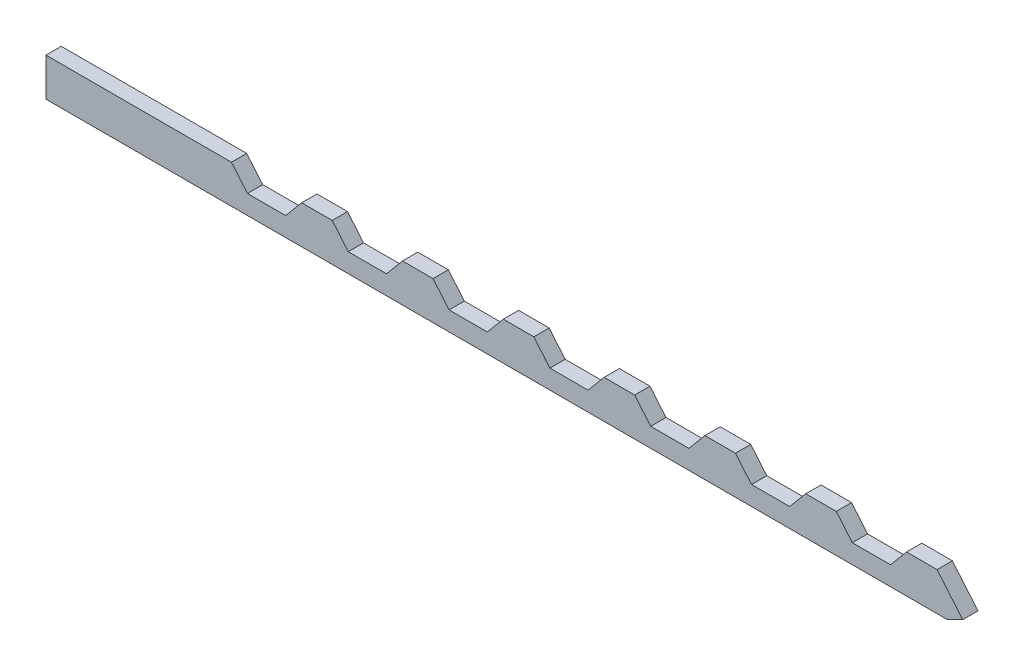
ISO-10303-21;
HEADER;
FILE_DESCRIPTION(('STEP AP214'),'2;1');
FILE_NAME('part.step','',(''),(''),'','','');
FILE_SCHEMA(('AUTOMOTIVE_DESIGN { 1 0 10303 214 1 1 1 1 }'));
ENDSEC;
DATA;
#1=APPLICATION_CONTEXT('core data for automotive mechanical design processes');
#2=APPLICATION_PROTOCOL_DEFINITION('international standard','automotive_design',2000,#1);
#3=PRODUCT_CONTEXT('',#1,'mechanical');
#4=PRODUCT('Part','Part','',(#3));
#5=PRODUCT_RELATED_PRODUCT_CATEGORY('part','',(#4));
#6=PRODUCT_DEFINITION_FORMATION('','',#4);
#7=PRODUCT_DEFINITION_CONTEXT('part definition',#1,'design');
#8=PRODUCT_DEFINITION('design','',#6,#7);
#9=PRODUCT_DEFINITION_SHAPE('','',#8);
#10=(LENGTH_UNIT() NAMED_UNIT(*) SI_UNIT(.MILLI.,.METRE.));
#11=(NAMED_UNIT(*) PLANE_ANGLE_UNIT() SI_UNIT($,.RADIAN.));
#12=(NAMED_UNIT(*) SI_UNIT($,.STERADIAN.) SOLID_ANGLE_UNIT());
#13=UNCERTAINTY_MEASURE_WITH_UNIT(LENGTH_MEASURE(1.E-05),#10,'distance_accuracy_value','');
#14=(GEOMETRIC_REPRESENTATION_CONTEXT(3) GLOBAL_UNCERTAINTY_ASSIGNED_CONTEXT((#13)) GLOBAL_UNIT_ASSIGNED_CONTEXT((#10,
#11,#12)) REPRESENTATION_CONTEXT('',''));
#15=CARTESIAN_POINT('',(0.,0.,0.));
#16=DIRECTION('',(0.,0.,1.));
#17=DIRECTION('',(1.,0.,0.));
#18=AXIS2_PLACEMENT_3D('',#15,#16,#17);
#19=CARTESIAN_POINT('',(152.4,6.35000000000002,5.08));
#20=DIRECTION('',(0.,-1.,0.));
#21=DIRECTION('',(1.,0.,0.));
#22=AXIS2_PLACEMENT_3D('',#19,#20,#21);
#23=PLANE('',#22);
#24=DIRECTION('',(0.,0.,1.));
#25=VECTOR('',#24,1.);
#26=CARTESIAN_POINT('',(110.358182431287,6.35000000000002,0.));
#27=LINE('',#26,#25);
#28=CARTESIAN_POINT('',(110.358182431287,6.35000000000002,0.));
#29=VERTEX_POINT('',#28);
#30=CARTESIAN_POINT('',(110.358182431287,6.35000000000002,5.08));
#31=VERTEX_POINT('',#30);
#32=EDGE_CURVE('E555',#29,#31,#27,.T.);
#33=ORIENTED_EDGE('',*,*,#32,.F.);
#34=DIRECTION('',(-1.,0.,0.));
#35=VECTOR('',#34,1.);
#36=CARTESIAN_POINT('',(152.4,6.35000000000002,0.));
#37=LINE('',#36,#35);
#38=CARTESIAN_POINT('',(100.198182431287,6.35000000000001,0.));
#39=VERTEX_POINT('',#38);
#40=EDGE_CURVE('E594',#29,#39,#37,.T.);
#41=ORIENTED_EDGE('',*,*,#40,.T.);
#42=DIRECTION('',(0.,0.,1.));
#43=VECTOR('',#42,1.);
#44=CARTESIAN_POINT('',(100.198182431287,6.35000000000001,0.));
#45=LINE('',#44,#43);
#46=CARTESIAN_POINT('',(100.198182431287,6.35000000000001,5.08));
#47=VERTEX_POINT('',#46);
#48=EDGE_CURVE('E508',#39,#47,#45,.T.);
#49=ORIENTED_EDGE('',*,*,#48,.T.);
#50=DIRECTION('',(-1.,0.,0.));
#51=VECTOR('',#50,1.);
#52=CARTESIAN_POINT('',(152.4,6.35000000000002,5.08));
#53=LINE('',#52,#51);
#54=EDGE_CURVE('E302',#31,#47,#53,.T.);
#55=ORIENTED_EDGE('',*,*,#54,.F.);
#56=EDGE_LOOP('',(#33,#41,#49,#55));
#57=FACE_BOUND('',#56,.T.);
#58=ADVANCED_FACE('F42',(#57),#23,.F.);
#59=DIRECTION('',(0.,0.,1.));
#60=VECTOR('',#59,1.);
#61=CARTESIAN_POINT('',(133.714747747239,6.35000000000002,0.));
#62=LINE('',#61,#60);
#63=CARTESIAN_POINT('',(133.714747747239,6.35000000000003,0.));
#64=VERTEX_POINT('',#63);
#65=CARTESIAN_POINT('',(133.714747747239,6.35000000000002,5.08));
#66=VERTEX_POINT('',#65);
#67=EDGE_CURVE('E550',#64,#66,#62,.T.);
#68=ORIENTED_EDGE('',*,*,#67,.T.);
#69=CARTESIAN_POINT('',(143.874747747239,6.35000000000002,5.08));
#70=VERTEX_POINT('',#69);
#71=EDGE_CURVE('E296',#70,#66,#53,.T.);
#72=ORIENTED_EDGE('',*,*,#71,.F.);
#73=DIRECTION('',(0.,0.,1.));
#74=VECTOR('',#73,1.);
#75=CARTESIAN_POINT('',(143.874747747239,6.35000000000002,0.));
#76=LINE('',#75,#74);
#77=CARTESIAN_POINT('',(143.874747747239,6.35000000000002,0.));
#78=VERTEX_POINT('',#77);
#79=EDGE_CURVE('E538',#78,#70,#76,.T.);
#80=ORIENTED_EDGE('',*,*,#79,.F.);
#81=EDGE_CURVE('E290',#78,#64,#37,.T.);
#82=ORIENTED_EDGE('',*,*,#81,.T.);
#83=EDGE_LOOP('',(#68,#72,#80,#82));
#84=FACE_BOUND('',#83,.T.);
#85=ADVANCED_FACE('F714',(#84),#23,.F.);
#86=DIRECTION('',(0.,0.,1.));
#87=VECTOR('',#86,1.);
#88=CARTESIAN_POINT('',(76.8416171153359,6.35000000000001,0.));
#89=LINE('',#88,#87);
#90=CARTESIAN_POINT('',(76.8416171153359,6.35000000000001,0.));
#91=VERTEX_POINT('',#90);
#92=CARTESIAN_POINT('',(76.8416171153359,6.35000000000001,5.08));
#93=VERTEX_POINT('',#92);
#94=EDGE_CURVE('E512',#91,#93,#89,.T.);
#95=ORIENTED_EDGE('',*,*,#94,.F.);
#96=CARTESIAN_POINT('',(66.6816171153359,6.35000000000001,0.));
#97=VERTEX_POINT('',#96);
#98=EDGE_CURVE('E598',#91,#97,#37,.T.);
#99=ORIENTED_EDGE('',*,*,#98,.T.);
#100=DIRECTION('',(0.,0.,1.));
#101=VECTOR('',#100,1.);
#102=CARTESIAN_POINT('',(66.6816171153359,6.35000000000001,0.));
#103=LINE('',#102,#101);
#104=CARTESIAN_POINT('',(66.6816171153359,6.35000000000001,5.08));
#105=VERTEX_POINT('',#104);
#106=EDGE_CURVE('E475',#97,#105,#103,.T.);
#107=ORIENTED_EDGE('',*,*,#106,.T.);
#108=EDGE_CURVE('E310',#93,#105,#53,.T.);
#109=ORIENTED_EDGE('',*,*,#108,.F.);
#110=EDGE_LOOP('',(#95,#99,#107,#109));
#111=FACE_BOUND('',#110,.T.);
#112=ADVANCED_FACE('F670',(#111),#23,.F.);
#113=DIRECTION('',(0.,0.,1.));
#114=VECTOR('',#113,1.);
#115=CARTESIAN_POINT('',(43.3250517993844,6.35,0.));
#116=LINE('',#115,#114);
#117=CARTESIAN_POINT('',(43.3250517993844,6.35,0.));
#118=VERTEX_POINT('',#117);
#119=CARTESIAN_POINT('',(43.3250517993844,6.35,5.08));
#120=VERTEX_POINT('',#119);
#121=EDGE_CURVE('E479',#118,#120,#116,.T.);
#122=ORIENTED_EDGE('',*,*,#121,.F.);
#123=CARTESIAN_POINT('',(33.1650517993844,6.35,0.));
#124=VERTEX_POINT('',#123);
#125=EDGE_CURVE('E603',#118,#124,#37,.T.);
#126=ORIENTED_EDGE('',*,*,#125,.T.);
#127=DIRECTION('',(0.,0.,1.));
#128=VECTOR('',#127,1.);
#129=CARTESIAN_POINT('',(33.1650517993844,6.35,0.));
#130=LINE('',#129,#128);
#131=CARTESIAN_POINT('',(33.1650517993844,6.35,5.08));
#132=VERTEX_POINT('',#131);
#133=EDGE_CURVE('E443',#124,#132,#130,.T.);
#134=ORIENTED_EDGE('',*,*,#133,.T.);
#135=EDGE_CURVE('E660',#120,#132,#53,.T.);
#136=ORIENTED_EDGE('',*,*,#135,.F.);
#137=EDGE_LOOP('',(#122,#126,#134,#136));
#138=FACE_BOUND('',#137,.T.);
#139=ADVANCED_FACE('F682',(#138),#23,.F.);
#140=DIRECTION('',(0.,0.,1.));
#141=VECTOR('',#140,1.);
#142=CARTESIAN_POINT('',(-23.7080788325185,6.35,0.));
#143=LINE('',#142,#141);
#144=CARTESIAN_POINT('',(-23.7080788325185,6.35,0.));
#145=VERTEX_POINT('',#144);
#146=CARTESIAN_POINT('',(-23.7080788325185,6.35,5.08));
#147=VERTEX_POINT('',#146);
#148=EDGE_CURVE('E409',#145,#147,#143,.T.);
#149=ORIENTED_EDGE('',*,*,#148,.F.);
#150=CARTESIAN_POINT('',(-33.8680788325185,6.35,0.));
#151=VERTEX_POINT('',#150);
#152=EDGE_CURVE('E615',#145,#151,#37,.T.);
#153=ORIENTED_EDGE('',*,*,#152,.T.);
#154=DIRECTION('',(0.,0.,1.));
#155=VECTOR('',#154,1.);
#156=CARTESIAN_POINT('',(-33.8680788325185,6.35,0.));
#157=LINE('',#156,#155);
#158=CARTESIAN_POINT('',(-33.8680788325185,6.35,5.08));
#159=VERTEX_POINT('',#158);
#160=EDGE_CURVE('E372',#151,#159,#157,.T.);
#161=ORIENTED_EDGE('',*,*,#160,.T.);
#162=EDGE_CURVE('E321',#147,#159,#53,.T.);
#163=ORIENTED_EDGE('',*,*,#162,.F.);
#164=EDGE_LOOP('',(#149,#153,#161,#163));
#165=FACE_BOUND('',#164,.T.);
#166=ADVANCED_FACE('F654',(#165),#23,.F.);
#167=CARTESIAN_POINT('',(9.80848648343298,6.35,5.08));
#168=VERTEX_POINT('',#167);
#169=CARTESIAN_POINT('',(-0.351513516567035,6.35,5.08));
#170=VERTEX_POINT('',#169);
#171=EDGE_CURVE('E657',#168,#170,#53,.T.);
#172=ORIENTED_EDGE('',*,*,#171,.F.);
#173=DIRECTION('',(0.,0.,1.));
#174=VECTOR('',#173,1.);
#175=CARTESIAN_POINT('',(9.80848648343298,6.35,0.));
#176=LINE('',#175,#174);
#177=CARTESIAN_POINT('',(9.80848648343298,6.35,0.));
#178=VERTEX_POINT('',#177);
#179=EDGE_CURVE('E433',#178,#168,#176,.T.);
#180=ORIENTED_EDGE('',*,*,#179,.F.);
#181=CARTESIAN_POINT('',(-0.351513516567035,6.35,0.));
#182=VERTEX_POINT('',#181);
#183=EDGE_CURVE('E609',#178,#182,#37,.T.);
#184=ORIENTED_EDGE('',*,*,#183,.T.);
#185=DIRECTION('',(0.,0.,1.));
#186=VECTOR('',#185,1.);
#187=CARTESIAN_POINT('',(-0.351513516567035,6.35,0.));
#188=LINE('',#187,#186);
#189=EDGE_CURVE('E405',#182,#170,#188,.T.);
#190=ORIENTED_EDGE('',*,*,#189,.T.);
#191=EDGE_LOOP('',(#172,#180,#184,#190));
#192=FACE_BOUND('',#191,.T.);
#193=ADVANCED_FACE('F692',(#192),#23,.F.);
#194=CARTESIAN_POINT('',(-57.2246441484699,6.34999999999999,5.08));
#195=VERTEX_POINT('',#194);
#196=CARTESIAN_POINT('',(-67.38464414847,6.34999999999999,5.08));
#197=VERTEX_POINT('',#196);
#198=EDGE_CURVE('E313',#195,#197,#53,.T.);
#199=ORIENTED_EDGE('',*,*,#198,.F.);
#200=DIRECTION('',(0.,0.,1.));
#201=VECTOR('',#200,1.);
#202=CARTESIAN_POINT('',(-57.2246441484699,6.34999999999999,0.));
#203=LINE('',#202,#201);
#204=CARTESIAN_POINT('',(-57.2246441484699,6.34999999999999,0.));
#205=VERTEX_POINT('',#204);
#206=EDGE_CURVE('E362',#205,#195,#203,.T.);
#207=ORIENTED_EDGE('',*,*,#206,.F.);
#208=CARTESIAN_POINT('',(-67.38464414847,6.34999999999999,0.));
#209=VERTEX_POINT('',#208);
#210=EDGE_CURVE('E288',#205,#209,#37,.T.);
#211=ORIENTED_EDGE('',*,*,#210,.T.);
#212=DIRECTION('',(0.,0.,1.));
#213=VECTOR('',#212,1.);
#214=CARTESIAN_POINT('',(-67.38464414847,6.34999999999999,0.));
#215=LINE('',#214,#213);
#216=EDGE_CURVE('E336',#209,#197,#215,.T.);
#217=ORIENTED_EDGE('',*,*,#216,.T.);
#218=EDGE_LOOP('',(#199,#207,#211,#217));
#219=FACE_BOUND('',#218,.T.);
#220=ADVANCED_FACE('F630',(#219),#23,.F.);
#221=CARTESIAN_POINT('',(0.,0.,5.08));
#222=DIRECTION('',(0.,0.,1.));
#223=DIRECTION('',(1.,0.,0.));
#224=AXIS2_PLACEMENT_3D('',#221,#222,#223);
#225=PLANE('',#224);
#226=DIRECTION('',(-0.894427190999915,-0.447213595499961,0.));
#227=VECTOR('',#226,1.);
#228=CARTESIAN_POINT('',(32.0040000000004,-64.0080000000003,5.08));
#229=LINE('',#228,#227);
#230=CARTESIAN_POINT('',(152.4,-3.80999999999997,5.08));
#231=VERTEX_POINT('',#230);
#232=CARTESIAN_POINT('',(147.32,-6.34999999999998,5.08));
#233=VERTEX_POINT('',#232);
#234=EDGE_CURVE('E263',#231,#233,#229,.T.);
#235=ORIENTED_EDGE('',*,*,#234,.F.);
#236=DIRECTION('',(0.642787609686543,-0.766044443118975,0.));
#237=VECTOR('',#236,1.);
#238=CARTESIAN_POINT('',(87.5559323687312,73.4681505579859,5.08));
#239=LINE('',#238,#237);
#240=EDGE_CURVE('E515',#70,#231,#239,.T.);
#241=ORIENTED_EDGE('',*,*,#240,.F.);
#242=ORIENTED_EDGE('',*,*,#71,.T.);
#243=DIRECTION('',(-0.642787609686538,-0.766044443118979,0.));
#244=VECTOR('',#243,1.);
#245=CARTESIAN_POINT('',(75.3402703945566,-63.2179931008687,5.08));
#246=LINE('',#245,#244);
#247=CARTESIAN_POINT('',(128.386465089263,0.,5.08));
#248=VERTEX_POINT('',#247);
#249=EDGE_CURVE('E566',#66,#248,#246,.T.);
#250=ORIENTED_EDGE('',*,*,#249,.T.);
#251=DIRECTION('',(-1.,0.,0.));
#252=VECTOR('',#251,1.);
#253=CARTESIAN_POINT('',(0.,0.,5.08));
#254=LINE('',#253,#252);
#255=CARTESIAN_POINT('',(115.686465089263,0.,5.08));
#256=VERTEX_POINT('',#255);
#257=EDGE_CURVE('E541',#248,#256,#254,.T.);
#258=ORIENTED_EDGE('',*,*,#257,.T.);
#259=DIRECTION('',(-0.642787609686538,0.76604444311898,0.));
#260=VECTOR('',#259,1.);
#261=CARTESIAN_POINT('',(67.8876044663715,56.9644638692411,5.08));
#262=LINE('',#261,#260);
#263=EDGE_CURVE('E561',#256,#31,#262,.T.);
#264=ORIENTED_EDGE('',*,*,#263,.T.);
#265=ORIENTED_EDGE('',*,*,#54,.T.);
#266=DIRECTION('',(-0.642787609686537,-0.76604444311898,0.));
#267=VECTOR('',#266,1.);
#268=CARTESIAN_POINT('',(55.671942492196,-46.7143064121242,5.08));
#269=LINE('',#268,#267);
#270=CARTESIAN_POINT('',(94.8698997733116,0.,5.08));
#271=VERTEX_POINT('',#270);
#272=EDGE_CURVE('E516',#47,#271,#269,.T.);
#273=ORIENTED_EDGE('',*,*,#272,.T.);
#274=DIRECTION('',(-1.,0.,0.));
#275=VECTOR('',#274,1.);
#276=CARTESIAN_POINT('',(0.,0.,5.08));
#277=LINE('',#276,#275);
#278=CARTESIAN_POINT('',(82.1698997733116,0.,5.08));
#279=VERTEX_POINT('',#278);
#280=EDGE_CURVE('E521',#271,#279,#277,.T.);
#281=ORIENTED_EDGE('',*,*,#280,.T.);
#282=DIRECTION('',(-0.642787609686537,0.76604444311898,0.));
#283=VECTOR('',#282,1.);
#284=CARTESIAN_POINT('',(48.219276564011,40.4607771804966,5.08));
#285=LINE('',#284,#283);
#286=EDGE_CURVE('E482',#279,#93,#285,.T.);
#287=ORIENTED_EDGE('',*,*,#286,.T.);
#288=ORIENTED_EDGE('',*,*,#108,.T.);
#289=DIRECTION('',(-0.642787609686537,-0.76604444311898,0.));
#290=VECTOR('',#289,1.);
#291=CARTESIAN_POINT('',(36.0036145898354,-30.2106197233796,5.08));
#292=LINE('',#291,#290);
#293=CARTESIAN_POINT('',(61.3533344573602,0.,5.08));
#294=VERTEX_POINT('',#293);
#295=EDGE_CURVE('E483',#105,#294,#292,.T.);
#296=ORIENTED_EDGE('',*,*,#295,.T.);
#297=DIRECTION('',(-1.,0.,0.));
#298=VECTOR('',#297,1.);
#299=CARTESIAN_POINT('',(0.,0.,5.08));
#300=LINE('',#299,#298);
#301=CARTESIAN_POINT('',(48.6533344573602,0.,5.08));
#302=VERTEX_POINT('',#301);
#303=EDGE_CURVE('E488',#294,#302,#300,.T.);
#304=ORIENTED_EDGE('',*,*,#303,.T.);
#305=DIRECTION('',(-0.642787609686537,0.76604444311898,0.));
#306=VECTOR('',#305,1.);
#307=CARTESIAN_POINT('',(28.5509486616503,23.9570904917521,5.08));
#308=LINE('',#307,#306);
#309=EDGE_CURVE('E447',#302,#120,#308,.T.);
#310=ORIENTED_EDGE('',*,*,#309,.T.);
#311=ORIENTED_EDGE('',*,*,#135,.T.);
#312=DIRECTION('',(-0.642787609686537,-0.76604444311898,0.));
#313=VECTOR('',#312,1.);
#314=CARTESIAN_POINT('',(16.3352866874748,-13.7069330346351,5.08));
#315=LINE('',#314,#313);
#316=CARTESIAN_POINT('',(27.8367691414087,0.,5.08));
#317=VERTEX_POINT('',#316);
#318=EDGE_CURVE('E448',#132,#317,#315,.T.);
#319=ORIENTED_EDGE('',*,*,#318,.T.);
#320=DIRECTION('',(-1.,0.,0.));
#321=VECTOR('',#320,1.);
#322=CARTESIAN_POINT('',(0.,0.,5.08));
#323=LINE('',#322,#321);
#324=CARTESIAN_POINT('',(15.1367691414087,0.,5.08));
#325=VERTEX_POINT('',#324);
#326=EDGE_CURVE('E453',#317,#325,#323,.T.);
#327=ORIENTED_EDGE('',*,*,#326,.T.);
#328=DIRECTION('',(0.642787609686538,-0.766044443118979,0.));
#329=VECTOR('',#328,1.);
#330=CARTESIAN_POINT('',(8.8826207592897,7.4534038030076,5.08));
#331=LINE('',#330,#329);
#332=EDGE_CURVE('E412',#168,#325,#331,.T.);
#333=ORIENTED_EDGE('',*,*,#332,.F.);
#334=ORIENTED_EDGE('',*,*,#171,.T.);
#335=DIRECTION('',(-0.642787609686537,-0.76604444311898,0.));
#336=VECTOR('',#335,1.);
#337=CARTESIAN_POINT('',(-3.33304121488587,2.79675365410939,5.08));
#338=LINE('',#337,#336);
#339=CARTESIAN_POINT('',(-5.67979617454276,0.,5.08));
#340=VERTEX_POINT('',#339);
#341=EDGE_CURVE('E413',#170,#340,#338,.T.);
#342=ORIENTED_EDGE('',*,*,#341,.T.);
#343=DIRECTION('',(-1.,0.,0.));
#344=VECTOR('',#343,1.);
#345=CARTESIAN_POINT('',(0.,0.,5.08));
#346=LINE('',#345,#344);
#347=CARTESIAN_POINT('',(-18.3797961745428,0.,5.08));
#348=VERTEX_POINT('',#347);
#349=EDGE_CURVE('E418',#340,#348,#346,.T.);
#350=ORIENTED_EDGE('',*,*,#349,.T.);
#351=DIRECTION('',(-0.642787609686538,0.76604444311898,0.));
#352=VECTOR('',#351,1.);
#353=CARTESIAN_POINT('',(-10.7857071430709,-9.05028288573692,5.08));
#354=LINE('',#353,#352);
#355=EDGE_CURVE('E376',#348,#147,#354,.T.);
#356=ORIENTED_EDGE('',*,*,#355,.T.);
#357=ORIENTED_EDGE('',*,*,#162,.T.);
#358=DIRECTION('',(-0.642787609686537,-0.76604444311898,0.));
#359=VECTOR('',#358,1.);
#360=CARTESIAN_POINT('',(-23.0013691172465,19.3004403428539,5.08));
#361=LINE('',#360,#359);
#362=CARTESIAN_POINT('',(-39.1963614904942,0.,5.08));
#363=VERTEX_POINT('',#362);
#364=EDGE_CURVE('E377',#159,#363,#361,.T.);
#365=ORIENTED_EDGE('',*,*,#364,.T.);
#366=DIRECTION('',(-1.,0.,0.));
#367=VECTOR('',#366,1.);
#368=CARTESIAN_POINT('',(0.,0.,5.08));
#369=LINE('',#368,#367);
#370=CARTESIAN_POINT('',(-51.8963614904942,0.,5.08));
#371=VERTEX_POINT('',#370);
#372=EDGE_CURVE('E382',#363,#371,#369,.T.);
#373=ORIENTED_EDGE('',*,*,#372,.T.);
#374=DIRECTION('',(0.642787609686538,-0.766044443118979,0.));
#375=VECTOR('',#374,1.);
#376=CARTESIAN_POINT('',(-30.4540350454315,-25.5539695744815,5.08));
#377=LINE('',#376,#375);
#378=EDGE_CURVE('E340',#195,#371,#377,.T.);
#379=ORIENTED_EDGE('',*,*,#378,.F.);
#380=ORIENTED_EDGE('',*,*,#198,.T.);
#381=DIRECTION('',(-0.642787609686537,-0.76604444311898,0.));
#382=VECTOR('',#381,1.);
#383=CARTESIAN_POINT('',(-42.6696970196072,35.8041270315984,5.08));
#384=LINE('',#383,#382);
#385=CARTESIAN_POINT('',(-72.7129268064457,0.,5.08));
#386=VERTEX_POINT('',#385);
#387=EDGE_CURVE('E341',#197,#386,#384,.T.);
#388=ORIENTED_EDGE('',*,*,#387,.T.);
#389=DIRECTION('',(-1.,0.,0.));
#390=VECTOR('',#389,1.);
#391=CARTESIAN_POINT('',(0.,0.,5.08));
#392=LINE('',#391,#390);
#393=CARTESIAN_POINT('',(-85.4129268064457,0.,5.08));
#394=VERTEX_POINT('',#393);
#395=EDGE_CURVE('E346',#386,#394,#392,.T.);
#396=ORIENTED_EDGE('',*,*,#395,.T.);
#397=DIRECTION('',(0.642787609686538,-0.766044443118979,0.));
#398=VECTOR('',#397,1.);
#399=CARTESIAN_POINT('',(-50.1223629477921,-42.057656263226,5.08));
#400=LINE('',#399,#398);
#401=CARTESIAN_POINT('',(-90.7412094644214,6.34999999999999,5.08));
#402=VERTEX_POINT('',#401);
#403=EDGE_CURVE('E268',#402,#394,#400,.T.);
#404=ORIENTED_EDGE('',*,*,#403,.F.);
#405=CARTESIAN_POINT('',(-152.4,6.34999999999998,5.08));
#406=VERTEX_POINT('',#405);
#407=EDGE_CURVE('E303',#402,#406,#53,.T.);
#408=ORIENTED_EDGE('',*,*,#407,.T.);
#409=DIRECTION('',(0.,-1.,0.));
#410=VECTOR('',#409,1.);
#411=CARTESIAN_POINT('',(-152.4,-6.35000000000002,5.08));
#412=LINE('',#411,#410);
#413=CARTESIAN_POINT('',(-152.4,-6.35000000000002,5.08));
#414=VERTEX_POINT('',#413);
#415=EDGE_CURVE('E322',#406,#414,#412,.T.);
#416=ORIENTED_EDGE('',*,*,#415,.T.);
#417=DIRECTION('',(1.,0.,0.));
#418=VECTOR('',#417,1.);
#419=CARTESIAN_POINT('',(152.4,-6.34999999999998,5.08));
#420=LINE('',#419,#418);
#421=EDGE_CURVE('E314',#414,#233,#420,.T.);
#422=ORIENTED_EDGE('',*,*,#421,.T.);
#423=EDGE_LOOP('',(#235,#241,#242,#250,#258,#264,#265,#273,#281,#287,#288,#296,#304,#310,#311,
#319,#327,#333,#334,#342,#350,#356,#357,#365,#373,#379,#380,#388,#396,#404,#408,#416,#422));
#424=FACE_BOUND('',#423,.T.);
#425=ADVANCED_FACE('F640',(#424),#225,.T.);
#426=CARTESIAN_POINT('',(0.,0.,0.));
#427=DIRECTION('',(0.,0.,1.));
#428=DIRECTION('',(1.,0.,0.));
#429=AXIS2_PLACEMENT_3D('',#426,#427,#428);
#430=PLANE('',#429);
#431=DIRECTION('',(0.642787609686543,-0.766044443118975,0.));
#432=VECTOR('',#431,1.);
#433=CARTESIAN_POINT('',(87.5559323687312,73.4681505579859,0.));
#434=LINE('',#433,#432);
#435=CARTESIAN_POINT('',(152.4,-3.80999999999997,0.));
#436=VERTEX_POINT('',#435);
#437=EDGE_CURVE('E276',#78,#436,#434,.T.);
#438=ORIENTED_EDGE('',*,*,#437,.T.);
#439=DIRECTION('',(-0.894427190999915,-0.447213595499961,0.));
#440=VECTOR('',#439,1.);
#441=CARTESIAN_POINT('',(32.0040000000004,-64.0080000000003,0.));
#442=LINE('',#441,#440);
#443=CARTESIAN_POINT('',(147.32,-6.34999999999998,0.));
#444=VERTEX_POINT('',#443);
#445=EDGE_CURVE('E260',#436,#444,#442,.T.);
#446=ORIENTED_EDGE('',*,*,#445,.T.);
#447=DIRECTION('',(1.,0.,0.));
#448=VECTOR('',#447,1.);
#449=CARTESIAN_POINT('',(152.4,-6.34999999999998,0.));
#450=LINE('',#449,#448);
#451=CARTESIAN_POINT('',(-152.4,-6.35000000000002,0.));
#452=VERTEX_POINT('',#451);
#453=EDGE_CURVE('E274',#452,#444,#450,.T.);
#454=ORIENTED_EDGE('',*,*,#453,.F.);
#455=DIRECTION('',(0.,-1.,0.));
#456=VECTOR('',#455,1.);
#457=CARTESIAN_POINT('',(-152.4,-6.35000000000002,0.));
#458=LINE('',#457,#456);
#459=CARTESIAN_POINT('',(-152.4,6.34999999999998,0.));
#460=VERTEX_POINT('',#459);
#461=EDGE_CURVE('E284',#460,#452,#458,.T.);
#462=ORIENTED_EDGE('',*,*,#461,.F.);
#463=CARTESIAN_POINT('',(-90.7412094644214,6.34999999999999,0.));
#464=VERTEX_POINT('',#463);
#465=EDGE_CURVE('E283',#464,#460,#37,.T.);
#466=ORIENTED_EDGE('',*,*,#465,.F.);
#467=DIRECTION('',(0.642787609686538,-0.766044443118979,0.));
#468=VECTOR('',#467,1.);
#469=CARTESIAN_POINT('',(-50.1223629477921,-42.057656263226,0.));
#470=LINE('',#469,#468);
#471=CARTESIAN_POINT('',(-85.4129268064457,0.,0.));
#472=VERTEX_POINT('',#471);
#473=EDGE_CURVE('E345',#464,#472,#470,.T.);
#474=ORIENTED_EDGE('',*,*,#473,.T.);
#475=DIRECTION('',(-1.,0.,0.));
#476=VECTOR('',#475,1.);
#477=CARTESIAN_POINT('',(0.,0.,0.));
#478=LINE('',#477,#476);
#479=CARTESIAN_POINT('',(-72.7129268064457,0.,0.));
#480=VERTEX_POINT('',#479);
#481=EDGE_CURVE('E355',#480,#472,#478,.T.);
#482=ORIENTED_EDGE('',*,*,#481,.F.);
#483=DIRECTION('',(-0.642787609686537,-0.76604444311898,0.));
#484=VECTOR('',#483,1.);
#485=CARTESIAN_POINT('',(-42.6696970196072,35.8041270315984,0.));
#486=LINE('',#485,#484);
#487=EDGE_CURVE('E330',#209,#480,#486,.T.);
#488=ORIENTED_EDGE('',*,*,#487,.F.);
#489=ORIENTED_EDGE('',*,*,#210,.F.);
#490=DIRECTION('',(0.642787609686538,-0.766044443118979,0.));
#491=VECTOR('',#490,1.);
#492=CARTESIAN_POINT('',(-30.4540350454315,-25.5539695744815,0.));
#493=LINE('',#492,#491);
#494=CARTESIAN_POINT('',(-51.8963614904942,0.,0.));
#495=VERTEX_POINT('',#494);
#496=EDGE_CURVE('E381',#205,#495,#493,.T.);
#497=ORIENTED_EDGE('',*,*,#496,.T.);
#498=DIRECTION('',(-1.,0.,0.));
#499=VECTOR('',#498,1.);
#500=CARTESIAN_POINT('',(0.,0.,0.));
#501=LINE('',#500,#499);
#502=CARTESIAN_POINT('',(-39.1963614904942,0.,0.));
#503=VERTEX_POINT('',#502);
#504=EDGE_CURVE('E391',#503,#495,#501,.T.);
#505=ORIENTED_EDGE('',*,*,#504,.F.);
#506=DIRECTION('',(-0.642787609686537,-0.76604444311898,0.));
#507=VECTOR('',#506,1.);
#508=CARTESIAN_POINT('',(-23.0013691172465,19.3004403428539,0.));
#509=LINE('',#508,#507);
#510=EDGE_CURVE('E366',#151,#503,#509,.T.);
#511=ORIENTED_EDGE('',*,*,#510,.F.);
#512=ORIENTED_EDGE('',*,*,#152,.F.);
#513=DIRECTION('',(-0.642787609686538,0.76604444311898,0.));
#514=VECTOR('',#513,1.);
#515=CARTESIAN_POINT('',(-10.7857071430709,-9.05028288573692,0.));
#516=LINE('',#515,#514);
#517=CARTESIAN_POINT('',(-18.3797961745428,0.,0.));
#518=VERTEX_POINT('',#517);
#519=EDGE_CURVE('E417',#518,#145,#516,.T.);
#520=ORIENTED_EDGE('',*,*,#519,.F.);
#521=DIRECTION('',(-1.,0.,0.));
#522=VECTOR('',#521,1.);
#523=CARTESIAN_POINT('',(0.,0.,0.));
#524=LINE('',#523,#522);
#525=CARTESIAN_POINT('',(-5.67979617454276,0.,0.));
#526=VERTEX_POINT('',#525);
#527=EDGE_CURVE('E428',#526,#518,#524,.T.);
#528=ORIENTED_EDGE('',*,*,#527,.F.);
#529=DIRECTION('',(-0.642787609686537,-0.76604444311898,0.));
#530=VECTOR('',#529,1.);
#531=CARTESIAN_POINT('',(-3.33304121488587,2.79675365410939,0.));
#532=LINE('',#531,#530);
#533=EDGE_CURVE('E402',#182,#526,#532,.T.);
#534=ORIENTED_EDGE('',*,*,#533,.F.);
#535=ORIENTED_EDGE('',*,*,#183,.F.);
#536=DIRECTION('',(0.642787609686538,-0.766044443118979,0.));
#537=VECTOR('',#536,1.);
#538=CARTESIAN_POINT('',(8.8826207592897,7.4534038030076,0.));
#539=LINE('',#538,#537);
#540=CARTESIAN_POINT('',(15.1367691414087,0.,0.));
#541=VERTEX_POINT('',#540);
#542=EDGE_CURVE('E452',#178,#541,#539,.T.);
#543=ORIENTED_EDGE('',*,*,#542,.T.);
#544=DIRECTION('',(-1.,0.,0.));
#545=VECTOR('',#544,1.);
#546=CARTESIAN_POINT('',(0.,0.,0.));
#547=LINE('',#546,#545);
#548=CARTESIAN_POINT('',(27.8367691414087,0.,0.));
#549=VERTEX_POINT('',#548);
#550=EDGE_CURVE('E462',#549,#541,#547,.T.);
#551=ORIENTED_EDGE('',*,*,#550,.F.);
#552=DIRECTION('',(-0.642787609686537,-0.76604444311898,0.));
#553=VECTOR('',#552,1.);
#554=CARTESIAN_POINT('',(16.3352866874748,-13.7069330346351,0.));
#555=LINE('',#554,#553);
#556=EDGE_CURVE('E437',#124,#549,#555,.T.);
#557=ORIENTED_EDGE('',*,*,#556,.F.);
#558=ORIENTED_EDGE('',*,*,#125,.F.);
#559=DIRECTION('',(-0.642787609686537,0.76604444311898,0.));
#560=VECTOR('',#559,1.);
#561=CARTESIAN_POINT('',(28.5509486616503,23.9570904917521,0.));
#562=LINE('',#561,#560);
#563=CARTESIAN_POINT('',(48.6533344573602,0.,0.));
#564=VERTEX_POINT('',#563);
#565=EDGE_CURVE('E487',#564,#118,#562,.T.);
#566=ORIENTED_EDGE('',*,*,#565,.F.);
#567=DIRECTION('',(-1.,0.,0.));
#568=VECTOR('',#567,1.);
#569=CARTESIAN_POINT('',(0.,0.,0.));
#570=LINE('',#569,#568);
#571=CARTESIAN_POINT('',(61.3533344573602,0.,0.));
#572=VERTEX_POINT('',#571);
#573=EDGE_CURVE('E497',#572,#564,#570,.T.);
#574=ORIENTED_EDGE('',*,*,#573,.F.);
#575=DIRECTION('',(-0.642787609686537,-0.76604444311898,0.));
#576=VECTOR('',#575,1.);
#577=CARTESIAN_POINT('',(36.0036145898354,-30.2106197233796,0.));
#578=LINE('',#577,#576);
#579=EDGE_CURVE('E472',#97,#572,#578,.T.);
#580=ORIENTED_EDGE('',*,*,#579,.F.);
#581=ORIENTED_EDGE('',*,*,#98,.F.);
#582=DIRECTION('',(-0.642787609686537,0.76604444311898,0.));
#583=VECTOR('',#582,1.);
#584=CARTESIAN_POINT('',(48.219276564011,40.4607771804966,0.));
#585=LINE('',#584,#583);
#586=CARTESIAN_POINT('',(82.1698997733116,0.,0.));
#587=VERTEX_POINT('',#586);
#588=EDGE_CURVE('E520',#587,#91,#585,.T.);
#589=ORIENTED_EDGE('',*,*,#588,.F.);
#590=DIRECTION('',(-1.,0.,0.));
#591=VECTOR('',#590,1.);
#592=CARTESIAN_POINT('',(0.,0.,0.));
#593=LINE('',#592,#591);
#594=CARTESIAN_POINT('',(94.8698997733116,0.,0.));
#595=VERTEX_POINT('',#594);
#596=EDGE_CURVE('E530',#595,#587,#593,.T.);
#597=ORIENTED_EDGE('',*,*,#596,.F.);
#598=DIRECTION('',(-0.642787609686537,-0.76604444311898,0.));
#599=VECTOR('',#598,1.);
#600=CARTESIAN_POINT('',(55.671942492196,-46.7143064121242,0.));
#601=LINE('',#600,#599);
#602=EDGE_CURVE('E505',#39,#595,#601,.T.);
#603=ORIENTED_EDGE('',*,*,#602,.F.);
#604=ORIENTED_EDGE('',*,*,#40,.F.);
#605=DIRECTION('',(-0.642787609686538,0.76604444311898,0.));
#606=VECTOR('',#605,1.);
#607=CARTESIAN_POINT('',(67.8876044663715,56.9644638692411,0.));
#608=LINE('',#607,#606);
#609=CARTESIAN_POINT('',(115.686465089263,0.,0.));
#610=VERTEX_POINT('',#609);
#611=EDGE_CURVE('E551',#610,#29,#608,.T.);
#612=ORIENTED_EDGE('',*,*,#611,.F.);
#613=DIRECTION('',(-1.,0.,0.));
#614=VECTOR('',#613,1.);
#615=CARTESIAN_POINT('',(0.,0.,0.));
#616=LINE('',#615,#614);
#617=CARTESIAN_POINT('',(128.386465089263,0.,0.));
#618=VERTEX_POINT('',#617);
#619=EDGE_CURVE('E565',#618,#610,#616,.T.);
#620=ORIENTED_EDGE('',*,*,#619,.F.);
#621=DIRECTION('',(-0.642787609686538,-0.766044443118979,0.));
#622=VECTOR('',#621,1.);
#623=CARTESIAN_POINT('',(75.3402703945566,-63.2179931008687,0.));
#624=LINE('',#623,#622);
#625=EDGE_CURVE('E574',#64,#618,#624,.T.);
#626=ORIENTED_EDGE('',*,*,#625,.F.);
#627=ORIENTED_EDGE('',*,*,#81,.F.);
#628=EDGE_LOOP('',(#438,#446,#454,#462,#466,#474,#482,#488,#489,#497,#505,#511,#512,#520,#528,
#534,#535,#543,#551,#557,#558,#566,#574,#580,#581,#589,#597,#603,#604,#612,#620,#626,#627));
#629=FACE_BOUND('',#628,.T.);
#630=ADVANCED_FACE('F272',(#629),#430,.F.);
#631=CARTESIAN_POINT('',(-152.4,-6.35000000000002,5.08));
#632=DIRECTION('',(1.,0.,0.));
#633=DIRECTION('',(0.,0.,-1.));
#634=AXIS2_PLACEMENT_3D('',#631,#632,#633);
#635=PLANE('',#634);
#636=ORIENTED_EDGE('',*,*,#461,.T.);
#637=DIRECTION('',(0.,0.,-1.));
#638=VECTOR('',#637,1.);
#639=CARTESIAN_POINT('',(-152.4,-6.35000000000002,5.08));
#640=LINE('',#639,#638);
#641=EDGE_CURVE('E11',#414,#452,#640,.T.);
#642=ORIENTED_EDGE('',*,*,#641,.F.);
#643=ORIENTED_EDGE('',*,*,#415,.F.);
#644=DIRECTION('',(0.,0.,-1.));
#645=VECTOR('',#644,1.);
#646=CARTESIAN_POINT('',(-152.4,6.34999999999998,5.08));
#647=LINE('',#646,#645);
#648=EDGE_CURVE('E51',#406,#460,#647,.T.);
#649=ORIENTED_EDGE('',*,*,#648,.T.);
#650=EDGE_LOOP('',(#636,#642,#643,#649));
#651=FACE_BOUND('',#650,.T.);
#652=ADVANCED_FACE('F44',(#651),#635,.F.);
#653=CARTESIAN_POINT('',(152.4,-6.34999999999998,5.08));
#654=DIRECTION('',(0.,1.,0.));
#655=DIRECTION('',(-1.,0.,0.));
#656=AXIS2_PLACEMENT_3D('',#653,#654,#655);
#657=PLANE('',#656);
#658=ORIENTED_EDGE('',*,*,#453,.T.);
#659=DIRECTION('',(0.,0.,1.));
#660=VECTOR('',#659,1.);
#661=CARTESIAN_POINT('',(147.32,-6.34999999999998,0.));
#662=LINE('',#661,#660);
#663=EDGE_CURVE('E257',#444,#233,#662,.T.);
#664=ORIENTED_EDGE('',*,*,#663,.T.);
#665=ORIENTED_EDGE('',*,*,#421,.F.);
#666=ORIENTED_EDGE('',*,*,#641,.T.);
#667=EDGE_LOOP('',(#658,#664,#665,#666));
#668=FACE_BOUND('',#667,.T.);
#669=ADVANCED_FACE('F279',(#668),#657,.F.);
#670=ORIENTED_EDGE('',*,*,#407,.F.);
#671=DIRECTION('',(0.,0.,1.));
#672=VECTOR('',#671,1.);
#673=CARTESIAN_POINT('',(-90.7412094644214,6.34999999999999,0.));
#674=LINE('',#673,#672);
#675=EDGE_CURVE('E326',#464,#402,#674,.T.);
#676=ORIENTED_EDGE('',*,*,#675,.F.);
#677=ORIENTED_EDGE('',*,*,#465,.T.);
#678=ORIENTED_EDGE('',*,*,#648,.F.);
#679=EDGE_LOOP('',(#670,#676,#677,#678));
#680=FACE_BOUND('',#679,.T.);
#681=ADVANCED_FACE('F716',(#680),#23,.F.);
#682=CARTESIAN_POINT('',(-42.6696970196072,35.8041270315984,0.));
#683=DIRECTION('',(-0.76604444311898,0.642787609686537,0.));
#684=DIRECTION('',(-0.642787609686537,-0.76604444311898,0.));
#685=AXIS2_PLACEMENT_3D('',#682,#683,#684);
#686=PLANE('',#685);
#687=ORIENTED_EDGE('',*,*,#387,.F.);
#688=ORIENTED_EDGE('',*,*,#216,.F.);
#689=ORIENTED_EDGE('',*,*,#487,.T.);
#690=DIRECTION('',(0.,0.,1.));
#691=VECTOR('',#690,1.);
#692=CARTESIAN_POINT('',(-72.7129268064457,0.,0.));
#693=LINE('',#692,#691);
#694=EDGE_CURVE('E333',#480,#386,#693,.T.);
#695=ORIENTED_EDGE('',*,*,#694,.T.);
#696=EDGE_LOOP('',(#687,#688,#689,#695));
#697=FACE_BOUND('',#696,.T.);
#698=ADVANCED_FACE('F636',(#697),#686,.T.);
#699=CARTESIAN_POINT('',(0.,0.,0.));
#700=DIRECTION('',(0.,1.,0.));
#701=DIRECTION('',(-1.,0.,0.));
#702=AXIS2_PLACEMENT_3D('',#699,#700,#701);
#703=PLANE('',#702);
#704=ORIENTED_EDGE('',*,*,#395,.F.);
#705=ORIENTED_EDGE('',*,*,#694,.F.);
#706=ORIENTED_EDGE('',*,*,#481,.T.);
#707=DIRECTION('',(0.,0.,1.));
#708=VECTOR('',#707,1.);
#709=CARTESIAN_POINT('',(-85.4129268064457,0.,0.));
#710=LINE('',#709,#708);
#711=EDGE_CURVE('E329',#472,#394,#710,.T.);
#712=ORIENTED_EDGE('',*,*,#711,.T.);
#713=EDGE_LOOP('',(#704,#705,#706,#712));
#714=FACE_BOUND('',#713,.T.);
#715=ADVANCED_FACE('F639',(#714),#703,.T.);
#716=CARTESIAN_POINT('',(-50.1223629477921,-42.057656263226,0.));
#717=DIRECTION('',(-0.766044443118979,-0.642787609686538,0.));
#718=DIRECTION('',(0.642787609686538,-0.766044443118979,0.));
#719=AXIS2_PLACEMENT_3D('',#716,#717,#718);
#720=PLANE('',#719);
#721=ORIENTED_EDGE('',*,*,#403,.T.);
#722=ORIENTED_EDGE('',*,*,#711,.F.);
#723=ORIENTED_EDGE('',*,*,#473,.F.);
#724=ORIENTED_EDGE('',*,*,#675,.T.);
#725=EDGE_LOOP('',(#721,#722,#723,#724));
#726=FACE_BOUND('',#725,.T.);
#727=ADVANCED_FACE('F801',(#726),#720,.F.);
#728=CARTESIAN_POINT('',(-23.0013691172465,19.3004403428539,0.));
#729=DIRECTION('',(-0.76604444311898,0.642787609686537,0.));
#730=DIRECTION('',(-0.642787609686537,-0.76604444311898,0.));
#731=AXIS2_PLACEMENT_3D('',#728,#729,#730);
#732=PLANE('',#731);
#733=ORIENTED_EDGE('',*,*,#364,.F.);
#734=ORIENTED_EDGE('',*,*,#160,.F.);
#735=ORIENTED_EDGE('',*,*,#510,.T.);
#736=DIRECTION('',(0.,0.,1.));
#737=VECTOR('',#736,1.);
#738=CARTESIAN_POINT('',(-39.1963614904942,0.,0.));
#739=LINE('',#738,#737);
#740=EDGE_CURVE('E369',#503,#363,#739,.T.);
#741=ORIENTED_EDGE('',*,*,#740,.T.);
#742=EDGE_LOOP('',(#733,#734,#735,#741));
#743=FACE_BOUND('',#742,.T.);
#744=ADVANCED_FACE('F651',(#743),#732,.T.);
#745=CARTESIAN_POINT('',(0.,0.,0.));
#746=DIRECTION('',(0.,1.,0.));
#747=DIRECTION('',(-1.,0.,0.));
#748=AXIS2_PLACEMENT_3D('',#745,#746,#747);
#749=PLANE('',#748);
#750=ORIENTED_EDGE('',*,*,#372,.F.);
#751=ORIENTED_EDGE('',*,*,#740,.F.);
#752=ORIENTED_EDGE('',*,*,#504,.T.);
#753=DIRECTION('',(0.,0.,1.));
#754=VECTOR('',#753,1.);
#755=CARTESIAN_POINT('',(-51.8963614904942,0.,0.));
#756=LINE('',#755,#754);
#757=EDGE_CURVE('E365',#495,#371,#756,.T.);
#758=ORIENTED_EDGE('',*,*,#757,.T.);
#759=EDGE_LOOP('',(#750,#751,#752,#758));
#760=FACE_BOUND('',#759,.T.);
#761=ADVANCED_FACE('F647',(#760),#749,.T.);
#762=CARTESIAN_POINT('',(-30.4540350454315,-25.5539695744815,0.));
#763=DIRECTION('',(-0.766044443118979,-0.642787609686538,0.));
#764=DIRECTION('',(0.642787609686538,-0.766044443118979,0.));
#765=AXIS2_PLACEMENT_3D('',#762,#763,#764);
#766=PLANE('',#765);
#767=ORIENTED_EDGE('',*,*,#378,.T.);
#768=ORIENTED_EDGE('',*,*,#757,.F.);
#769=ORIENTED_EDGE('',*,*,#496,.F.);
#770=ORIENTED_EDGE('',*,*,#206,.T.);
#771=EDGE_LOOP('',(#767,#768,#769,#770));
#772=FACE_BOUND('',#771,.T.);
#773=ADVANCED_FACE('F644',(#772),#766,.F.);
#774=CARTESIAN_POINT('',(-10.7857071430709,-9.05028288573692,0.));
#775=DIRECTION('',(0.766044443118979,0.642787609686538,0.));
#776=DIRECTION('',(-0.642787609686538,0.766044443118979,0.));
#777=AXIS2_PLACEMENT_3D('',#774,#775,#776);
#778=PLANE('',#777);
#779=ORIENTED_EDGE('',*,*,#355,.F.);
#780=DIRECTION('',(0.,0.,1.));
#781=VECTOR('',#780,1.);
#782=CARTESIAN_POINT('',(-18.3797961745428,0.,0.));
#783=LINE('',#782,#781);
#784=EDGE_CURVE('E398',#518,#348,#783,.T.);
#785=ORIENTED_EDGE('',*,*,#784,.F.);
#786=ORIENTED_EDGE('',*,*,#519,.T.);
#787=ORIENTED_EDGE('',*,*,#148,.T.);
#788=EDGE_LOOP('',(#779,#785,#786,#787));
#789=FACE_BOUND('',#788,.T.);
#790=ADVANCED_FACE('F702',(#789),#778,.T.);
#791=CARTESIAN_POINT('',(-3.33304121488587,2.79675365410939,0.));
#792=DIRECTION('',(-0.76604444311898,0.642787609686537,0.));
#793=DIRECTION('',(-0.642787609686537,-0.76604444311898,0.));
#794=AXIS2_PLACEMENT_3D('',#791,#792,#793);
#795=PLANE('',#794);
#796=ORIENTED_EDGE('',*,*,#341,.F.);
#797=ORIENTED_EDGE('',*,*,#189,.F.);
#798=ORIENTED_EDGE('',*,*,#533,.T.);
#799=DIRECTION('',(0.,0.,1.));
#800=VECTOR('',#799,1.);
#801=CARTESIAN_POINT('',(-5.67979617454276,0.,0.));
#802=LINE('',#801,#800);
#803=EDGE_CURVE('E401',#526,#340,#802,.T.);
#804=ORIENTED_EDGE('',*,*,#803,.T.);
#805=EDGE_LOOP('',(#796,#797,#798,#804));
#806=FACE_BOUND('',#805,.T.);
#807=ADVANCED_FACE('F695',(#806),#795,.T.);
#808=CARTESIAN_POINT('',(0.,0.,0.));
#809=DIRECTION('',(0.,1.,0.));
#810=DIRECTION('',(-1.,0.,0.));
#811=AXIS2_PLACEMENT_3D('',#808,#809,#810);
#812=PLANE('',#811);
#813=ORIENTED_EDGE('',*,*,#349,.F.);
#814=ORIENTED_EDGE('',*,*,#803,.F.);
#815=ORIENTED_EDGE('',*,*,#527,.T.);
#816=ORIENTED_EDGE('',*,*,#784,.T.);
#817=EDGE_LOOP('',(#813,#814,#815,#816));
#818=FACE_BOUND('',#817,.T.);
#819=ADVANCED_FACE('F700',(#818),#812,.T.);
#820=CARTESIAN_POINT('',(16.3352866874748,-13.7069330346351,0.));
#821=DIRECTION('',(-0.76604444311898,0.642787609686537,0.));
#822=DIRECTION('',(-0.642787609686537,-0.76604444311898,0.));
#823=AXIS2_PLACEMENT_3D('',#820,#821,#822);
#824=PLANE('',#823);
#825=ORIENTED_EDGE('',*,*,#318,.F.);
#826=ORIENTED_EDGE('',*,*,#133,.F.);
#827=ORIENTED_EDGE('',*,*,#556,.T.);
#828=DIRECTION('',(0.,0.,1.));
#829=VECTOR('',#828,1.);
#830=CARTESIAN_POINT('',(27.8367691414087,0.,0.));
#831=LINE('',#830,#829);
#832=EDGE_CURVE('E440',#549,#317,#831,.T.);
#833=ORIENTED_EDGE('',*,*,#832,.T.);
#834=EDGE_LOOP('',(#825,#826,#827,#833));
#835=FACE_BOUND('',#834,.T.);
#836=ADVANCED_FACE('F685',(#835),#824,.T.);
#837=CARTESIAN_POINT('',(0.,0.,0.));
#838=DIRECTION('',(0.,1.,0.));
#839=DIRECTION('',(-1.,0.,0.));
#840=AXIS2_PLACEMENT_3D('',#837,#838,#839);
#841=PLANE('',#840);
#842=ORIENTED_EDGE('',*,*,#326,.F.);
#843=ORIENTED_EDGE('',*,*,#832,.F.);
#844=ORIENTED_EDGE('',*,*,#550,.T.);
#845=DIRECTION('',(0.,0.,1.));
#846=VECTOR('',#845,1.);
#847=CARTESIAN_POINT('',(15.1367691414087,0.,0.));
#848=LINE('',#847,#846);
#849=EDGE_CURVE('E436',#541,#325,#848,.T.);
#850=ORIENTED_EDGE('',*,*,#849,.T.);
#851=EDGE_LOOP('',(#842,#843,#844,#850));
#852=FACE_BOUND('',#851,.T.);
#853=ADVANCED_FACE('F690',(#852),#841,.T.);
#854=CARTESIAN_POINT('',(8.8826207592897,7.4534038030076,0.));
#855=DIRECTION('',(-0.76604444311898,-0.642787609686538,0.));
#856=DIRECTION('',(0.642787609686538,-0.76604444311898,0.));
#857=AXIS2_PLACEMENT_3D('',#854,#855,#856);
#858=PLANE('',#857);
#859=ORIENTED_EDGE('',*,*,#332,.T.);
#860=ORIENTED_EDGE('',*,*,#849,.F.);
#861=ORIENTED_EDGE('',*,*,#542,.F.);
#862=ORIENTED_EDGE('',*,*,#179,.T.);
#863=EDGE_LOOP('',(#859,#860,#861,#862));
#864=FACE_BOUND('',#863,.T.);
#865=ADVANCED_FACE('F874',(#864),#858,.F.);
#866=CARTESIAN_POINT('',(28.5509486616503,23.9570904917521,0.));
#867=DIRECTION('',(0.76604444311898,0.642787609686537,0.));
#868=DIRECTION('',(-0.642787609686537,0.76604444311898,0.));
#869=AXIS2_PLACEMENT_3D('',#866,#867,#868);
#870=PLANE('',#869);
#871=ORIENTED_EDGE('',*,*,#309,.F.);
#872=DIRECTION('',(0.,0.,1.));
#873=VECTOR('',#872,1.);
#874=CARTESIAN_POINT('',(48.6533344573602,0.,0.));
#875=LINE('',#874,#873);
#876=EDGE_CURVE('E469',#564,#302,#875,.T.);
#877=ORIENTED_EDGE('',*,*,#876,.F.);
#878=ORIENTED_EDGE('',*,*,#565,.T.);
#879=ORIENTED_EDGE('',*,*,#121,.T.);
#880=EDGE_LOOP('',(#871,#877,#878,#879));
#881=FACE_BOUND('',#880,.T.);
#882=ADVANCED_FACE('F681',(#881),#870,.T.);
#883=CARTESIAN_POINT('',(36.0036145898354,-30.2106197233796,0.));
#884=DIRECTION('',(-0.76604444311898,0.642787609686537,0.));
#885=DIRECTION('',(-0.642787609686537,-0.76604444311898,0.));
#886=AXIS2_PLACEMENT_3D('',#883,#884,#885);
#887=PLANE('',#886);
#888=ORIENTED_EDGE('',*,*,#295,.F.);
#889=ORIENTED_EDGE('',*,*,#106,.F.);
#890=ORIENTED_EDGE('',*,*,#579,.T.);
#891=DIRECTION('',(0.,0.,1.));
#892=VECTOR('',#891,1.);
#893=CARTESIAN_POINT('',(61.3533344573602,0.,0.));
#894=LINE('',#893,#892);
#895=EDGE_CURVE('E66',#572,#294,#894,.T.);
#896=ORIENTED_EDGE('',*,*,#895,.T.);
#897=EDGE_LOOP('',(#888,#889,#890,#896));
#898=FACE_BOUND('',#897,.T.);
#899=ADVANCED_FACE('F673',(#898),#887,.T.);
#900=CARTESIAN_POINT('',(0.,0.,0.));
#901=DIRECTION('',(0.,1.,0.));
#902=DIRECTION('',(-1.,0.,0.));
#903=AXIS2_PLACEMENT_3D('',#900,#901,#902);
#904=PLANE('',#903);
#905=ORIENTED_EDGE('',*,*,#303,.F.);
#906=ORIENTED_EDGE('',*,*,#895,.F.);
#907=ORIENTED_EDGE('',*,*,#573,.T.);
#908=ORIENTED_EDGE('',*,*,#876,.T.);
#909=EDGE_LOOP('',(#905,#906,#907,#908));
#910=FACE_BOUND('',#909,.T.);
#911=ADVANCED_FACE('F678',(#910),#904,.T.);
#912=CARTESIAN_POINT('',(48.219276564011,40.4607771804966,0.));
#913=DIRECTION('',(0.76604444311898,0.642787609686537,0.));
#914=DIRECTION('',(-0.642787609686537,0.76604444311898,0.));
#915=AXIS2_PLACEMENT_3D('',#912,#913,#914);
#916=PLANE('',#915);
#917=ORIENTED_EDGE('',*,*,#286,.F.);
#918=DIRECTION('',(0.,0.,1.));
#919=VECTOR('',#918,1.);
#920=CARTESIAN_POINT('',(82.1698997733116,0.,0.));
#921=LINE('',#920,#919);
#922=EDGE_CURVE('E502',#587,#279,#921,.T.);
#923=ORIENTED_EDGE('',*,*,#922,.F.);
#924=ORIENTED_EDGE('',*,*,#588,.T.);
#925=ORIENTED_EDGE('',*,*,#94,.T.);
#926=EDGE_LOOP('',(#917,#923,#924,#925));
#927=FACE_BOUND('',#926,.T.);
#928=ADVANCED_FACE('F911',(#927),#916,.T.);
#929=CARTESIAN_POINT('',(55.671942492196,-46.7143064121242,0.));
#930=DIRECTION('',(-0.76604444311898,0.642787609686537,0.));
#931=DIRECTION('',(-0.642787609686537,-0.76604444311898,0.));
#932=AXIS2_PLACEMENT_3D('',#929,#930,#931);
#933=PLANE('',#932);
#934=ORIENTED_EDGE('',*,*,#272,.F.);
#935=ORIENTED_EDGE('',*,*,#48,.F.);
#936=ORIENTED_EDGE('',*,*,#602,.T.);
#937=DIRECTION('',(0.,0.,1.));
#938=VECTOR('',#937,1.);
#939=CARTESIAN_POINT('',(94.8698997733116,0.,0.));
#940=LINE('',#939,#938);
#941=EDGE_CURVE('E58',#595,#271,#940,.T.);
#942=ORIENTED_EDGE('',*,*,#941,.T.);
#943=EDGE_LOOP('',(#934,#935,#936,#942));
#944=FACE_BOUND('',#943,.T.);
#945=ADVANCED_FACE('F920',(#944),#933,.T.);
#946=CARTESIAN_POINT('',(0.,0.,0.));
#947=DIRECTION('',(0.,1.,0.));
#948=DIRECTION('',(-1.,0.,0.));
#949=AXIS2_PLACEMENT_3D('',#946,#947,#948);
#950=PLANE('',#949);
#951=ORIENTED_EDGE('',*,*,#280,.F.);
#952=ORIENTED_EDGE('',*,*,#941,.F.);
#953=ORIENTED_EDGE('',*,*,#596,.T.);
#954=ORIENTED_EDGE('',*,*,#922,.T.);
#955=EDGE_LOOP('',(#951,#952,#953,#954));
#956=FACE_BOUND('',#955,.T.);
#957=ADVANCED_FACE('F931',(#956),#950,.T.);
#958=CARTESIAN_POINT('',(87.5559323687312,73.4681505579859,0.));
#959=DIRECTION('',(-0.766044443118975,-0.642787609686543,0.));
#960=DIRECTION('',(0.642787609686543,-0.766044443118975,0.));
#961=AXIS2_PLACEMENT_3D('',#958,#959,#960);
#962=PLANE('',#961);
#963=ORIENTED_EDGE('',*,*,#240,.T.);
#964=DIRECTION('',(0.,0.,1.));
#965=VECTOR('',#964,1.);
#966=CARTESIAN_POINT('',(152.4,-3.80999999999997,0.));
#967=LINE('',#966,#965);
#968=EDGE_CURVE('E535',#436,#231,#967,.T.);
#969=ORIENTED_EDGE('',*,*,#968,.F.);
#970=ORIENTED_EDGE('',*,*,#437,.F.);
#971=ORIENTED_EDGE('',*,*,#79,.T.);
#972=EDGE_LOOP('',(#963,#969,#970,#971));
#973=FACE_BOUND('',#972,.T.);
#974=ADVANCED_FACE('F943',(#973),#962,.F.);
#975=CARTESIAN_POINT('',(0.,0.,0.));
#976=DIRECTION('',(0.,1.,0.));
#977=DIRECTION('',(-1.,0.,0.));
#978=AXIS2_PLACEMENT_3D('',#975,#976,#977);
#979=PLANE('',#978);
#980=ORIENTED_EDGE('',*,*,#257,.F.);
#981=DIRECTION('',(0.,0.,1.));
#982=VECTOR('',#981,1.);
#983=CARTESIAN_POINT('',(128.386465089263,0.,0.));
#984=LINE('',#983,#982);
#985=EDGE_CURVE('E547',#618,#248,#984,.T.);
#986=ORIENTED_EDGE('',*,*,#985,.F.);
#987=ORIENTED_EDGE('',*,*,#619,.T.);
#988=DIRECTION('',(0.,0.,1.));
#989=VECTOR('',#988,1.);
#990=CARTESIAN_POINT('',(115.686465089263,0.,0.));
#991=LINE('',#990,#989);
#992=EDGE_CURVE('E291',#610,#256,#991,.T.);
#993=ORIENTED_EDGE('',*,*,#992,.T.);
#994=EDGE_LOOP('',(#980,#986,#987,#993));
#995=FACE_BOUND('',#994,.T.);
#996=ADVANCED_FACE('F585',(#995),#979,.T.);
#997=CARTESIAN_POINT('',(67.8876044663715,56.9644638692411,0.));
#998=DIRECTION('',(0.76604444311898,0.642787609686537,0.));
#999=DIRECTION('',(-0.642787609686537,0.76604444311898,0.));
#1000=AXIS2_PLACEMENT_3D('',#997,#998,#999);
#1001=PLANE('',#1000);
#1002=ORIENTED_EDGE('',*,*,#263,.F.);
#1003=ORIENTED_EDGE('',*,*,#992,.F.);
#1004=ORIENTED_EDGE('',*,*,#611,.T.);
#1005=ORIENTED_EDGE('',*,*,#32,.T.);
#1006=EDGE_LOOP('',(#1002,#1003,#1004,#1005));
#1007=FACE_BOUND('',#1006,.T.);
#1008=ADVANCED_FACE('F589',(#1007),#1001,.T.);
#1009=CARTESIAN_POINT('',(75.3402703945566,-63.2179931008687,0.));
#1010=DIRECTION('',(-0.76604444311898,0.642787609686538,0.));
#1011=DIRECTION('',(-0.642787609686538,-0.76604444311898,0.));
#1012=AXIS2_PLACEMENT_3D('',#1009,#1010,#1011);
#1013=PLANE('',#1012);
#1014=ORIENTED_EDGE('',*,*,#249,.F.);
#1015=ORIENTED_EDGE('',*,*,#67,.F.);
#1016=ORIENTED_EDGE('',*,*,#625,.T.);
#1017=ORIENTED_EDGE('',*,*,#985,.T.);
#1018=EDGE_LOOP('',(#1014,#1015,#1016,#1017));
#1019=FACE_BOUND('',#1018,.T.);
#1020=ADVANCED_FACE('F971',(#1019),#1013,.T.);
#1021=CARTESIAN_POINT('',(32.0040000000004,-64.0080000000003,0.));
#1022=DIRECTION('',(-0.447213595499961,0.894427190999914,0.));
#1023=DIRECTION('',(-0.894427190999915,-0.447213595499961,0.));
#1024=AXIS2_PLACEMENT_3D('',#1021,#1022,#1023);
#1025=PLANE('',#1024);
#1026=ORIENTED_EDGE('',*,*,#234,.T.);
#1027=ORIENTED_EDGE('',*,*,#663,.F.);
#1028=ORIENTED_EDGE('',*,*,#445,.F.);
#1029=ORIENTED_EDGE('',*,*,#968,.T.);
#1030=EDGE_LOOP('',(#1026,#1027,#1028,#1029));
#1031=FACE_BOUND('',#1030,.T.);
#1032=ADVANCED_FACE('F259',(#1031),#1025,.F.);
#1033=CLOSED_SHELL('',(#58,#85,#112,#139,#166,#193,#220,#425,#630,#652,#669,#681,#698,#715,#727,
#744,#761,#773,#790,#807,#819,#836,#853,#865,#882,#899,#911,#928,#945,#957,#974,#996,#1008,
#1020,#1032));
#1034=MANIFOLD_SOLID_BREP('B2',#1033);
#1035=ADVANCED_BREP_SHAPE_REPRESENTATION('',(#18,#1034),#14);
#1036=SHAPE_DEFINITION_REPRESENTATION(#9,#1035);
ENDSEC;
END-ISO-10303-21;
